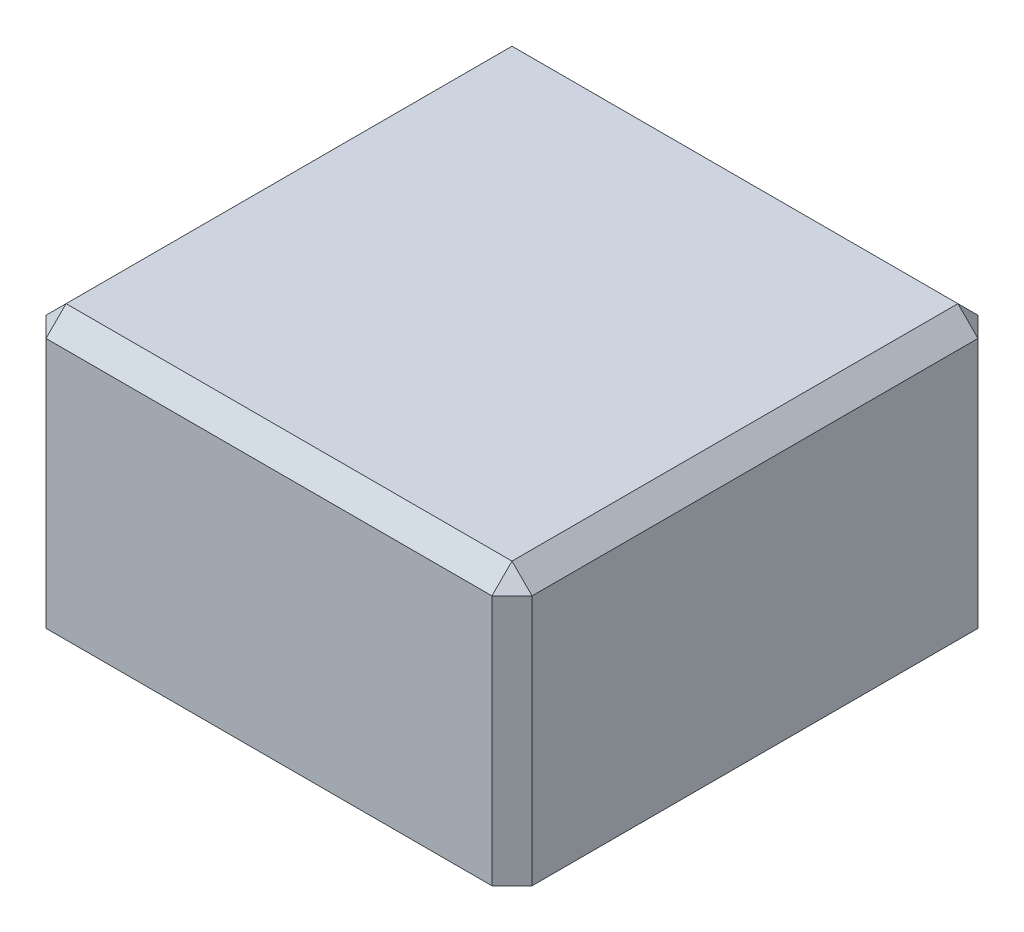
ISO-10303-21;
HEADER;
FILE_DESCRIPTION(('STEP AP214'),'2;1');
FILE_NAME('part.step','',(''),(''),'','','');
FILE_SCHEMA(('AUTOMOTIVE_DESIGN { 1 0 10303 214 1 1 1 1 }'));
ENDSEC;
DATA;
#1=APPLICATION_CONTEXT('core data for automotive mechanical design processes');
#2=APPLICATION_PROTOCOL_DEFINITION('international standard','automotive_design',2000,#1);
#3=PRODUCT_CONTEXT('',#1,'mechanical');
#4=PRODUCT('Part','Part','',(#3));
#5=PRODUCT_RELATED_PRODUCT_CATEGORY('part','',(#4));
#6=PRODUCT_DEFINITION_FORMATION('','',#4);
#7=PRODUCT_DEFINITION_CONTEXT('part definition',#1,'design');
#8=PRODUCT_DEFINITION('design','',#6,#7);
#9=PRODUCT_DEFINITION_SHAPE('','',#8);
#10=(LENGTH_UNIT() NAMED_UNIT(*) SI_UNIT(.MILLI.,.METRE.));
#11=(NAMED_UNIT(*) PLANE_ANGLE_UNIT() SI_UNIT($,.RADIAN.));
#12=(NAMED_UNIT(*) SI_UNIT($,.STERADIAN.) SOLID_ANGLE_UNIT());
#13=UNCERTAINTY_MEASURE_WITH_UNIT(LENGTH_MEASURE(1.E-05),#10,'distance_accuracy_value','');
#14=(GEOMETRIC_REPRESENTATION_CONTEXT(3) GLOBAL_UNCERTAINTY_ASSIGNED_CONTEXT((#13)) GLOBAL_UNIT_ASSIGNED_CONTEXT((#10,
#11,#12)) REPRESENTATION_CONTEXT('',''));
#15=CARTESIAN_POINT('',(0.,0.,0.));
#16=DIRECTION('',(0.,0.,1.));
#17=DIRECTION('',(1.,0.,0.));
#18=AXIS2_PLACEMENT_3D('',#15,#16,#17);
#19=CARTESIAN_POINT('',(-22.2,-63.4479364188578,24.2));
#20=DIRECTION('',(0.,0.,1.));
#21=DIRECTION('',(1.,0.,0.));
#22=AXIS2_PLACEMENT_3D('',#19,#20,#21);
#23=PLANE('',#22);
#24=DIRECTION('',(1.,0.,0.));
#25=VECTOR('',#24,1.);
#26=CARTESIAN_POINT('',(-22.2,5.2,24.2));
#27=LINE('',#26,#25);
#28=CARTESIAN_POINT('',(-22.2,5.2,24.2));
#29=VERTEX_POINT('',#28);
#30=CARTESIAN_POINT('',(22.2,5.2,24.2));
#31=VERTEX_POINT('',#30);
#32=EDGE_CURVE('E182',#29,#31,#27,.T.);
#33=ORIENTED_EDGE('',*,*,#32,.T.);
#34=DIRECTION('',(0.,1.,0.));
#35=VECTOR('',#34,1.);
#36=CARTESIAN_POINT('',(22.2,-63.4479364188578,24.2));
#37=LINE('',#36,#35);
#38=CARTESIAN_POINT('',(22.2,30.2,24.2));
#39=VERTEX_POINT('',#38);
#40=EDGE_CURVE('E225',#31,#39,#37,.T.);
#41=ORIENTED_EDGE('',*,*,#40,.T.);
#42=DIRECTION('',(-1.,0.,0.));
#43=VECTOR('',#42,1.);
#44=CARTESIAN_POINT('',(-22.2,30.2,24.2));
#45=LINE('',#44,#43);
#46=CARTESIAN_POINT('',(-22.2,30.2,24.2));
#47=VERTEX_POINT('',#46);
#48=EDGE_CURVE('E223',#39,#47,#45,.T.);
#49=ORIENTED_EDGE('',*,*,#48,.T.);
#50=DIRECTION('',(0.,-1.,0.));
#51=VECTOR('',#50,1.);
#52=CARTESIAN_POINT('',(-22.2,-63.4479364188578,24.2));
#53=LINE('',#52,#51);
#54=EDGE_CURVE('E221',#47,#29,#53,.T.);
#55=ORIENTED_EDGE('',*,*,#54,.T.);
#56=EDGE_LOOP('',(#33,#41,#49,#55));
#57=FACE_BOUND('',#56,.T.);
#58=ADVANCED_FACE('F38',(#57),#23,.T.);
#59=CARTESIAN_POINT('',(-24.2,-63.4479364188578,-22.2));
#60=DIRECTION('',(-1.,0.,0.));
#61=DIRECTION('',(0.,0.,1.));
#62=AXIS2_PLACEMENT_3D('',#59,#60,#61);
#63=PLANE('',#62);
#64=DIRECTION('',(0.,0.,1.));
#65=VECTOR('',#64,1.);
#66=CARTESIAN_POINT('',(-24.2,5.2,-22.2));
#67=LINE('',#66,#65);
#68=CARTESIAN_POINT('',(-24.2,5.2,-22.2));
#69=VERTEX_POINT('',#68);
#70=CARTESIAN_POINT('',(-24.2,5.2,22.2));
#71=VERTEX_POINT('',#70);
#72=EDGE_CURVE('E185',#69,#71,#67,.T.);
#73=ORIENTED_EDGE('',*,*,#72,.T.);
#74=DIRECTION('',(0.,1.,0.));
#75=VECTOR('',#74,1.);
#76=CARTESIAN_POINT('',(-24.2,-63.4479364188578,22.2));
#77=LINE('',#76,#75);
#78=CARTESIAN_POINT('',(-24.2,30.2,22.2));
#79=VERTEX_POINT('',#78);
#80=EDGE_CURVE('E11',#71,#79,#77,.T.);
#81=ORIENTED_EDGE('',*,*,#80,.T.);
#82=DIRECTION('',(0.,0.,-1.));
#83=VECTOR('',#82,1.);
#84=CARTESIAN_POINT('',(-24.2,30.2,-22.2));
#85=LINE('',#84,#83);
#86=CARTESIAN_POINT('',(-24.2,30.2,-22.2));
#87=VERTEX_POINT('',#86);
#88=EDGE_CURVE('E48',#79,#87,#85,.T.);
#89=ORIENTED_EDGE('',*,*,#88,.T.);
#90=DIRECTION('',(0.,-1.,0.));
#91=VECTOR('',#90,1.);
#92=CARTESIAN_POINT('',(-24.2,-63.4479364188578,-22.2));
#93=LINE('',#92,#91);
#94=EDGE_CURVE('E227',#87,#69,#93,.T.);
#95=ORIENTED_EDGE('',*,*,#94,.T.);
#96=EDGE_LOOP('',(#73,#81,#89,#95));
#97=FACE_BOUND('',#96,.T.);
#98=ADVANCED_FACE('F297',(#97),#63,.T.);
#99=CARTESIAN_POINT('',(22.2,-63.4479364188578,-24.2));
#100=DIRECTION('',(0.,0.,-1.));
#101=DIRECTION('',(-1.,0.,0.));
#102=AXIS2_PLACEMENT_3D('',#99,#100,#101);
#103=PLANE('',#102);
#104=DIRECTION('',(1.,0.,0.));
#105=VECTOR('',#104,1.);
#106=CARTESIAN_POINT('',(22.2,30.2,-24.2));
#107=LINE('',#106,#105);
#108=CARTESIAN_POINT('',(-22.2,30.2,-24.2));
#109=VERTEX_POINT('',#108);
#110=CARTESIAN_POINT('',(22.2,30.2,-24.2));
#111=VERTEX_POINT('',#110);
#112=EDGE_CURVE('E202',#109,#111,#107,.T.);
#113=ORIENTED_EDGE('',*,*,#112,.T.);
#114=DIRECTION('',(0.,-1.,0.));
#115=VECTOR('',#114,1.);
#116=CARTESIAN_POINT('',(22.2,-63.4479364188578,-24.2));
#117=LINE('',#116,#115);
#118=CARTESIAN_POINT('',(22.2,5.2,-24.2));
#119=VERTEX_POINT('',#118);
#120=EDGE_CURVE('E205',#111,#119,#117,.T.);
#121=ORIENTED_EDGE('',*,*,#120,.T.);
#122=DIRECTION('',(-1.,0.,0.));
#123=VECTOR('',#122,1.);
#124=CARTESIAN_POINT('',(22.2,5.2,-24.2));
#125=LINE('',#124,#123);
#126=CARTESIAN_POINT('',(-22.2,5.2,-24.2));
#127=VERTEX_POINT('',#126);
#128=EDGE_CURVE('E173',#119,#127,#125,.T.);
#129=ORIENTED_EDGE('',*,*,#128,.T.);
#130=DIRECTION('',(0.,1.,0.));
#131=VECTOR('',#130,1.);
#132=CARTESIAN_POINT('',(-22.2,-63.4479364188578,-24.2));
#133=LINE('',#132,#131);
#134=EDGE_CURVE('E200',#127,#109,#133,.T.);
#135=ORIENTED_EDGE('',*,*,#134,.T.);
#136=EDGE_LOOP('',(#113,#121,#129,#135));
#137=FACE_BOUND('',#136,.T.);
#138=ADVANCED_FACE('F312',(#137),#103,.T.);
#139=CARTESIAN_POINT('',(24.2,-63.4479364188578,22.2));
#140=DIRECTION('',(1.,0.,0.));
#141=DIRECTION('',(0.,0.,-1.));
#142=AXIS2_PLACEMENT_3D('',#139,#140,#141);
#143=PLANE('',#142);
#144=DIRECTION('',(0.,0.,-1.));
#145=VECTOR('',#144,1.);
#146=CARTESIAN_POINT('',(24.2,5.2,22.2));
#147=LINE('',#146,#145);
#148=CARTESIAN_POINT('',(24.2,5.2,22.2));
#149=VERTEX_POINT('',#148);
#150=CARTESIAN_POINT('',(24.2,5.2,-22.2));
#151=VERTEX_POINT('',#150);
#152=EDGE_CURVE('E167',#149,#151,#147,.T.);
#153=ORIENTED_EDGE('',*,*,#152,.T.);
#154=DIRECTION('',(0.,1.,0.));
#155=VECTOR('',#154,1.);
#156=CARTESIAN_POINT('',(24.2,-63.4479364188578,-22.2));
#157=LINE('',#156,#155);
#158=CARTESIAN_POINT('',(24.2,30.2,-22.2));
#159=VERTEX_POINT('',#158);
#160=EDGE_CURVE('E211',#151,#159,#157,.T.);
#161=ORIENTED_EDGE('',*,*,#160,.T.);
#162=DIRECTION('',(0.,0.,1.));
#163=VECTOR('',#162,1.);
#164=CARTESIAN_POINT('',(24.2,30.2,22.2));
#165=LINE('',#164,#163);
#166=CARTESIAN_POINT('',(24.2,30.2,22.2));
#167=VERTEX_POINT('',#166);
#168=EDGE_CURVE('E209',#159,#167,#165,.T.);
#169=ORIENTED_EDGE('',*,*,#168,.T.);
#170=DIRECTION('',(0.,-1.,0.));
#171=VECTOR('',#170,1.);
#172=CARTESIAN_POINT('',(24.2,-63.4479364188578,22.2));
#173=LINE('',#172,#171);
#174=EDGE_CURVE('E207',#167,#149,#173,.T.);
#175=ORIENTED_EDGE('',*,*,#174,.T.);
#176=EDGE_LOOP('',(#153,#161,#169,#175));
#177=FACE_BOUND('',#176,.T.);
#178=ADVANCED_FACE('F320',(#177),#143,.T.);
#179=CARTESIAN_POINT('',(-22.2,-63.4479364188578,22.2));
#180=DIRECTION('',(0.,0.,1.));
#181=DIRECTION('',(1.,0.,0.));
#182=AXIS2_PLACEMENT_3D('',#179,#180,#181);
#183=PLANE('',#182);
#184=DIRECTION('',(1.,0.,0.));
#185=VECTOR('',#184,1.);
#186=CARTESIAN_POINT('',(-22.2,5.2,22.2));
#187=LINE('',#186,#185);
#188=CARTESIAN_POINT('',(-22.2,5.2,22.2));
#189=VERTEX_POINT('',#188);
#190=CARTESIAN_POINT('',(22.2,5.2,22.2));
#191=VERTEX_POINT('',#190);
#192=EDGE_CURVE('E174',#189,#191,#187,.T.);
#193=ORIENTED_EDGE('',*,*,#192,.F.);
#194=DIRECTION('',(0.,1.,0.));
#195=VECTOR('',#194,1.);
#196=CARTESIAN_POINT('',(-22.2,-63.4479364188578,22.2));
#197=LINE('',#196,#195);
#198=CARTESIAN_POINT('',(-22.2,30.2,22.2));
#199=VERTEX_POINT('',#198);
#200=EDGE_CURVE('E160',#189,#199,#197,.T.);
#201=ORIENTED_EDGE('',*,*,#200,.T.);
#202=DIRECTION('',(1.,0.,0.));
#203=VECTOR('',#202,1.);
#204=CARTESIAN_POINT('',(-22.2,30.2,22.2));
#205=LINE('',#204,#203);
#206=CARTESIAN_POINT('',(22.2,30.2,22.2));
#207=VERTEX_POINT('',#206);
#208=EDGE_CURVE('E142',#199,#207,#205,.T.);
#209=ORIENTED_EDGE('',*,*,#208,.T.);
#210=DIRECTION('',(0.,1.,0.));
#211=VECTOR('',#210,1.);
#212=CARTESIAN_POINT('',(22.2,-63.4479364188578,22.2));
#213=LINE('',#212,#211);
#214=EDGE_CURVE('E149',#191,#207,#213,.T.);
#215=ORIENTED_EDGE('',*,*,#214,.F.);
#216=EDGE_LOOP('',(#193,#201,#209,#215));
#217=FACE_BOUND('',#216,.T.);
#218=ADVANCED_FACE('F158',(#217),#183,.F.);
#219=CARTESIAN_POINT('',(-22.2,-63.4479364188578,-22.2));
#220=DIRECTION('',(-1.,0.,0.));
#221=DIRECTION('',(0.,0.,1.));
#222=AXIS2_PLACEMENT_3D('',#219,#220,#221);
#223=PLANE('',#222);
#224=DIRECTION('',(0.,0.,1.));
#225=VECTOR('',#224,1.);
#226=CARTESIAN_POINT('',(-22.2,5.2,-22.2));
#227=LINE('',#226,#225);
#228=CARTESIAN_POINT('',(-22.2,5.2,-22.2));
#229=VERTEX_POINT('',#228);
#230=EDGE_CURVE('E148',#229,#189,#227,.T.);
#231=ORIENTED_EDGE('',*,*,#230,.F.);
#232=DIRECTION('',(0.,1.,0.));
#233=VECTOR('',#232,1.);
#234=CARTESIAN_POINT('',(-22.2,-63.4479364188578,-22.2));
#235=LINE('',#234,#233);
#236=CARTESIAN_POINT('',(-22.2,30.2,-22.2));
#237=VERTEX_POINT('',#236);
#238=EDGE_CURVE('E162',#229,#237,#235,.T.);
#239=ORIENTED_EDGE('',*,*,#238,.T.);
#240=DIRECTION('',(0.,0.,1.));
#241=VECTOR('',#240,1.);
#242=CARTESIAN_POINT('',(-22.2,30.2,-22.2));
#243=LINE('',#242,#241);
#244=EDGE_CURVE('E165',#237,#199,#243,.T.);
#245=ORIENTED_EDGE('',*,*,#244,.T.);
#246=ORIENTED_EDGE('',*,*,#200,.F.);
#247=EDGE_LOOP('',(#231,#239,#245,#246));
#248=FACE_BOUND('',#247,.T.);
#249=ADVANCED_FACE('F341',(#248),#223,.F.);
#250=CARTESIAN_POINT('',(22.2,-63.4479364188578,-22.2));
#251=DIRECTION('',(0.,0.,-1.));
#252=DIRECTION('',(-1.,0.,0.));
#253=AXIS2_PLACEMENT_3D('',#250,#251,#252);
#254=PLANE('',#253);
#255=DIRECTION('',(-1.,0.,0.));
#256=VECTOR('',#255,1.);
#257=CARTESIAN_POINT('',(22.2,5.2,-22.2));
#258=LINE('',#257,#256);
#259=CARTESIAN_POINT('',(22.2,5.2,-22.2));
#260=VERTEX_POINT('',#259);
#261=EDGE_CURVE('E178',#260,#229,#258,.T.);
#262=ORIENTED_EDGE('',*,*,#261,.F.);
#263=DIRECTION('',(0.,1.,0.));
#264=VECTOR('',#263,1.);
#265=CARTESIAN_POINT('',(22.2,-63.4479364188578,-22.2));
#266=LINE('',#265,#264);
#267=CARTESIAN_POINT('',(22.2,30.2,-22.2));
#268=VERTEX_POINT('',#267);
#269=EDGE_CURVE('E190',#260,#268,#266,.T.);
#270=ORIENTED_EDGE('',*,*,#269,.T.);
#271=DIRECTION('',(-1.,0.,0.));
#272=VECTOR('',#271,1.);
#273=CARTESIAN_POINT('',(22.2,30.2,-22.2));
#274=LINE('',#273,#272);
#275=EDGE_CURVE('E145',#268,#237,#274,.T.);
#276=ORIENTED_EDGE('',*,*,#275,.T.);
#277=ORIENTED_EDGE('',*,*,#238,.F.);
#278=EDGE_LOOP('',(#262,#270,#276,#277));
#279=FACE_BOUND('',#278,.T.);
#280=ADVANCED_FACE('F338',(#279),#254,.F.);
#281=CARTESIAN_POINT('',(22.2,-63.4479364188578,22.2));
#282=DIRECTION('',(1.,0.,0.));
#283=DIRECTION('',(0.,0.,-1.));
#284=AXIS2_PLACEMENT_3D('',#281,#282,#283);
#285=PLANE('',#284);
#286=DIRECTION('',(0.,0.,-1.));
#287=VECTOR('',#286,1.);
#288=CARTESIAN_POINT('',(22.2,5.2,22.2));
#289=LINE('',#288,#287);
#290=EDGE_CURVE('E154',#191,#260,#289,.T.);
#291=ORIENTED_EDGE('',*,*,#290,.F.);
#292=ORIENTED_EDGE('',*,*,#214,.T.);
#293=DIRECTION('',(0.,0.,-1.));
#294=VECTOR('',#293,1.);
#295=CARTESIAN_POINT('',(22.2,30.2,22.2));
#296=LINE('',#295,#294);
#297=EDGE_CURVE('E138',#207,#268,#296,.T.);
#298=ORIENTED_EDGE('',*,*,#297,.T.);
#299=ORIENTED_EDGE('',*,*,#269,.F.);
#300=EDGE_LOOP('',(#291,#292,#298,#299));
#301=FACE_BOUND('',#300,.T.);
#302=ADVANCED_FACE('F152',(#301),#285,.F.);
#303=CARTESIAN_POINT('',(0.,5.2,0.));
#304=DIRECTION('',(0.,-1.,0.));
#305=DIRECTION('',(0.,0.,-1.));
#306=AXIS2_PLACEMENT_3D('',#303,#304,#305);
#307=PLANE('',#306);
#308=ORIENTED_EDGE('',*,*,#128,.F.);
#309=DIRECTION('',(-0.707106781186544,0.,-0.707106781186551));
#310=VECTOR('',#309,1.);
#311=CARTESIAN_POINT('',(23.2000000000001,5.2,-23.1999999999999));
#312=LINE('',#311,#310);
#313=EDGE_CURVE('E219',#119,#151,#312,.F.);
#314=ORIENTED_EDGE('',*,*,#313,.T.);
#315=ORIENTED_EDGE('',*,*,#152,.F.);
#316=DIRECTION('',(0.707106781186549,0.,-0.707106781186546));
#317=VECTOR('',#316,1.);
#318=CARTESIAN_POINT('',(23.2,5.2,23.2));
#319=LINE('',#318,#317);
#320=EDGE_CURVE('E217',#149,#31,#319,.F.);
#321=ORIENTED_EDGE('',*,*,#320,.T.);
#322=ORIENTED_EDGE('',*,*,#32,.F.);
#323=DIRECTION('',(0.707106781186544,0.,0.707106781186551));
#324=VECTOR('',#323,1.);
#325=CARTESIAN_POINT('',(-23.2000000000001,5.2,23.1999999999999));
#326=LINE('',#325,#324);
#327=EDGE_CURVE('E215',#29,#71,#326,.F.);
#328=ORIENTED_EDGE('',*,*,#327,.T.);
#329=ORIENTED_EDGE('',*,*,#72,.F.);
#330=DIRECTION('',(-0.707106781186549,0.,0.707106781186546));
#331=VECTOR('',#330,1.);
#332=CARTESIAN_POINT('',(-23.2,5.2,-23.2));
#333=LINE('',#332,#331);
#334=EDGE_CURVE('E213',#69,#127,#333,.F.);
#335=ORIENTED_EDGE('',*,*,#334,.T.);
#336=EDGE_LOOP('',(#308,#314,#315,#321,#322,#328,#329,#335));
#337=FACE_BOUND('',#336,.T.);
#338=ORIENTED_EDGE('',*,*,#230,.T.);
#339=ORIENTED_EDGE('',*,*,#192,.T.);
#340=ORIENTED_EDGE('',*,*,#290,.T.);
#341=ORIENTED_EDGE('',*,*,#261,.T.);
#342=EDGE_LOOP('',(#338,#339,#340,#341));
#343=FACE_BOUND('',#342,.T.);
#344=ADVANCED_FACE('F294',(#337,#343),#307,.T.);
#345=CARTESIAN_POINT('',(0.,30.2,0.));
#346=DIRECTION('',(0.,1.,0.));
#347=DIRECTION('',(0.,0.,1.));
#348=AXIS2_PLACEMENT_3D('',#345,#346,#347);
#349=PLANE('',#348);
#350=ORIENTED_EDGE('',*,*,#208,.F.);
#351=ORIENTED_EDGE('',*,*,#244,.F.);
#352=ORIENTED_EDGE('',*,*,#275,.F.);
#353=ORIENTED_EDGE('',*,*,#297,.F.);
#354=EDGE_LOOP('',(#350,#351,#352,#353));
#355=FACE_BOUND('',#354,.T.);
#356=ADVANCED_FACE('F140',(#355),#349,.F.);
#357=CARTESIAN_POINT('',(0.,32.2,0.));
#358=DIRECTION('',(0.,1.,0.));
#359=DIRECTION('',(0.,0.,1.));
#360=AXIS2_PLACEMENT_3D('',#357,#358,#359);
#361=PLANE('',#360);
#362=DIRECTION('',(0.,0.,-1.));
#363=VECTOR('',#362,1.);
#364=CARTESIAN_POINT('',(22.2,32.2,0.));
#365=LINE('',#364,#363);
#366=CARTESIAN_POINT('',(22.2,32.2,22.2));
#367=VERTEX_POINT('',#366);
#368=CARTESIAN_POINT('',(22.2,32.2,-22.2));
#369=VERTEX_POINT('',#368);
#370=EDGE_CURVE('E195',#367,#369,#365,.T.);
#371=ORIENTED_EDGE('',*,*,#370,.T.);
#372=DIRECTION('',(-1.,0.,0.));
#373=VECTOR('',#372,1.);
#374=CARTESIAN_POINT('',(0.,32.2,-22.2));
#375=LINE('',#374,#373);
#376=CARTESIAN_POINT('',(-22.2,32.2,-22.2));
#377=VERTEX_POINT('',#376);
#378=EDGE_CURVE('E197',#369,#377,#375,.T.);
#379=ORIENTED_EDGE('',*,*,#378,.T.);
#380=DIRECTION('',(0.,0.,1.));
#381=VECTOR('',#380,1.);
#382=CARTESIAN_POINT('',(-22.2,32.2,0.));
#383=LINE('',#382,#381);
#384=CARTESIAN_POINT('',(-22.2,32.2,22.2));
#385=VERTEX_POINT('',#384);
#386=EDGE_CURVE('E181',#377,#385,#383,.T.);
#387=ORIENTED_EDGE('',*,*,#386,.T.);
#388=DIRECTION('',(1.,0.,0.));
#389=VECTOR('',#388,1.);
#390=CARTESIAN_POINT('',(0.,32.2,22.2));
#391=LINE('',#390,#389);
#392=EDGE_CURVE('E193',#385,#367,#391,.T.);
#393=ORIENTED_EDGE('',*,*,#392,.T.);
#394=EDGE_LOOP('',(#371,#379,#387,#393));
#395=FACE_BOUND('',#394,.T.);
#396=ADVANCED_FACE('F276',(#395),#361,.T.);
#397=CARTESIAN_POINT('',(22.2,-63.4479364188578,24.2));
#398=DIRECTION('',(-0.707106781186546,0.,-0.707106781186549));
#399=DIRECTION('',(0.,1.,0.));
#400=AXIS2_PLACEMENT_3D('',#397,#398,#399);
#401=PLANE('',#400);
#402=ORIENTED_EDGE('',*,*,#320,.F.);
#403=ORIENTED_EDGE('',*,*,#174,.F.);
#404=DIRECTION('',(-0.707106781186549,0.,0.707106781186546));
#405=VECTOR('',#404,1.);
#406=CARTESIAN_POINT('',(24.2,30.2,22.2));
#407=LINE('',#406,#405);
#408=EDGE_CURVE('E43',#39,#167,#407,.F.);
#409=ORIENTED_EDGE('',*,*,#408,.F.);
#410=ORIENTED_EDGE('',*,*,#40,.F.);
#411=EDGE_LOOP('',(#402,#403,#409,#410));
#412=FACE_BOUND('',#411,.T.);
#413=ADVANCED_FACE('F41',(#412),#401,.F.);
#414=CARTESIAN_POINT('',(0.,32.2,22.2));
#415=DIRECTION('',(0.,-0.707106781186545,-0.70710678118655));
#416=DIRECTION('',(1.,0.,0.));
#417=AXIS2_PLACEMENT_3D('',#414,#415,#416);
#418=PLANE('',#417);
#419=DIRECTION('',(0.,-0.70710678118655,0.707106781186545));
#420=VECTOR('',#419,1.);
#421=CARTESIAN_POINT('',(-22.2,30.2,24.2));
#422=LINE('',#421,#420);
#423=EDGE_CURVE('E255',#47,#385,#422,.F.);
#424=ORIENTED_EDGE('',*,*,#423,.F.);
#425=ORIENTED_EDGE('',*,*,#48,.F.);
#426=DIRECTION('',(0.,0.70710678118655,-0.707106781186545));
#427=VECTOR('',#426,1.);
#428=CARTESIAN_POINT('',(22.2,31.2,23.2));
#429=LINE('',#428,#427);
#430=EDGE_CURVE('E257',#367,#39,#429,.F.);
#431=ORIENTED_EDGE('',*,*,#430,.F.);
#432=ORIENTED_EDGE('',*,*,#392,.F.);
#433=EDGE_LOOP('',(#424,#425,#431,#432));
#434=FACE_BOUND('',#433,.T.);
#435=ADVANCED_FACE('F283',(#434),#418,.F.);
#436=CARTESIAN_POINT('',(-24.2,-63.4479364188578,22.2));
#437=DIRECTION('',(0.707106781186551,0.,-0.707106781186544));
#438=DIRECTION('',(0.,1.,0.));
#439=AXIS2_PLACEMENT_3D('',#436,#437,#438);
#440=PLANE('',#439);
#441=ORIENTED_EDGE('',*,*,#327,.F.);
#442=ORIENTED_EDGE('',*,*,#54,.F.);
#443=DIRECTION('',(-0.707106781186544,0.,-0.707106781186551));
#444=VECTOR('',#443,1.);
#445=CARTESIAN_POINT('',(-22.2,30.2,24.2));
#446=LINE('',#445,#444);
#447=EDGE_CURVE('E252',#79,#47,#446,.F.);
#448=ORIENTED_EDGE('',*,*,#447,.F.);
#449=ORIENTED_EDGE('',*,*,#80,.F.);
#450=EDGE_LOOP('',(#441,#442,#448,#449));
#451=FACE_BOUND('',#450,.T.);
#452=ADVANCED_FACE('F289',(#451),#440,.F.);
#453=CARTESIAN_POINT('',(24.2,30.2,22.2));
#454=DIRECTION('',(0.577350269189626,0.577350269189624,0.577350269189628));
#455=DIRECTION('',(0.707106781186549,0.,-0.707106781186546));
#456=AXIS2_PLACEMENT_3D('',#453,#454,#455);
#457=PLANE('',#456);
#458=ORIENTED_EDGE('',*,*,#430,.T.);
#459=ORIENTED_EDGE('',*,*,#408,.T.);
#460=DIRECTION('',(0.707106781186545,-0.70710678118655,0.));
#461=VECTOR('',#460,1.);
#462=CARTESIAN_POINT('',(24.2,30.2,22.2));
#463=LINE('',#462,#461);
#464=EDGE_CURVE('E249',#367,#167,#463,.T.);
#465=ORIENTED_EDGE('',*,*,#464,.F.);
#466=EDGE_LOOP('',(#458,#459,#465));
#467=FACE_BOUND('',#466,.T.);
#468=ADVANCED_FACE('F264',(#467),#457,.T.);
#469=CARTESIAN_POINT('',(-22.2,30.2,24.2));
#470=DIRECTION('',(-0.577350269189631,0.577350269189622,0.577350269189625));
#471=DIRECTION('',(0.707106781186544,0.,0.707106781186551));
#472=AXIS2_PLACEMENT_3D('',#469,#470,#471);
#473=PLANE('',#472);
#474=ORIENTED_EDGE('',*,*,#447,.T.);
#475=ORIENTED_EDGE('',*,*,#423,.T.);
#476=DIRECTION('',(0.707106781186545,0.70710678118655,0.));
#477=VECTOR('',#476,1.);
#478=CARTESIAN_POINT('',(-23.2,31.2,22.2));
#479=LINE('',#478,#477);
#480=EDGE_CURVE('E246',#79,#385,#479,.T.);
#481=ORIENTED_EDGE('',*,*,#480,.F.);
#482=EDGE_LOOP('',(#474,#475,#481));
#483=FACE_BOUND('',#482,.T.);
#484=ADVANCED_FACE('F388',(#483),#473,.T.);
#485=CARTESIAN_POINT('',(24.2,-63.4479364188578,-22.2));
#486=DIRECTION('',(-0.707106781186551,0.,0.707106781186544));
#487=DIRECTION('',(0.,1.,0.));
#488=AXIS2_PLACEMENT_3D('',#485,#486,#487);
#489=PLANE('',#488);
#490=ORIENTED_EDGE('',*,*,#313,.F.);
#491=ORIENTED_EDGE('',*,*,#120,.F.);
#492=DIRECTION('',(0.707106781186544,0.,0.707106781186551));
#493=VECTOR('',#492,1.);
#494=CARTESIAN_POINT('',(22.2,30.2,-24.2));
#495=LINE('',#494,#493);
#496=EDGE_CURVE('E243',#159,#111,#495,.F.);
#497=ORIENTED_EDGE('',*,*,#496,.F.);
#498=ORIENTED_EDGE('',*,*,#160,.F.);
#499=EDGE_LOOP('',(#490,#491,#497,#498));
#500=FACE_BOUND('',#499,.T.);
#501=ADVANCED_FACE('F318',(#500),#489,.F.);
#502=CARTESIAN_POINT('',(22.2,32.2,0.));
#503=DIRECTION('',(-0.70710678118655,-0.707106781186545,0.));
#504=DIRECTION('',(0.,0.,-1.));
#505=AXIS2_PLACEMENT_3D('',#502,#503,#504);
#506=PLANE('',#505);
#507=ORIENTED_EDGE('',*,*,#464,.T.);
#508=ORIENTED_EDGE('',*,*,#168,.F.);
#509=DIRECTION('',(-0.707106781186545,0.70710678118655,0.));
#510=VECTOR('',#509,1.);
#511=CARTESIAN_POINT('',(23.2,31.2,-22.2));
#512=LINE('',#511,#510);
#513=EDGE_CURVE('E240',#369,#159,#512,.F.);
#514=ORIENTED_EDGE('',*,*,#513,.F.);
#515=ORIENTED_EDGE('',*,*,#370,.F.);
#516=EDGE_LOOP('',(#507,#508,#514,#515));
#517=FACE_BOUND('',#516,.T.);
#518=ADVANCED_FACE('F271',(#517),#506,.F.);
#519=CARTESIAN_POINT('',(-22.2,32.2,0.));
#520=DIRECTION('',(0.70710678118655,-0.707106781186545,0.));
#521=DIRECTION('',(0.,0.,1.));
#522=AXIS2_PLACEMENT_3D('',#519,#520,#521);
#523=PLANE('',#522);
#524=ORIENTED_EDGE('',*,*,#480,.T.);
#525=ORIENTED_EDGE('',*,*,#386,.F.);
#526=DIRECTION('',(-0.707106781186545,-0.70710678118655,0.));
#527=VECTOR('',#526,1.);
#528=CARTESIAN_POINT('',(-22.2,32.2,-22.2));
#529=LINE('',#528,#527);
#530=EDGE_CURVE('E237',#87,#377,#529,.F.);
#531=ORIENTED_EDGE('',*,*,#530,.F.);
#532=ORIENTED_EDGE('',*,*,#88,.F.);
#533=EDGE_LOOP('',(#524,#525,#531,#532));
#534=FACE_BOUND('',#533,.T.);
#535=ADVANCED_FACE('F305',(#534),#523,.F.);
#536=CARTESIAN_POINT('',(-22.2,-63.4479364188578,-24.2));
#537=DIRECTION('',(0.707106781186546,0.,0.707106781186549));
#538=DIRECTION('',(0.,1.,0.));
#539=AXIS2_PLACEMENT_3D('',#536,#537,#538);
#540=PLANE('',#539);
#541=ORIENTED_EDGE('',*,*,#334,.F.);
#542=ORIENTED_EDGE('',*,*,#94,.F.);
#543=DIRECTION('',(0.707106781186549,0.,-0.707106781186546));
#544=VECTOR('',#543,1.);
#545=CARTESIAN_POINT('',(-23.2,30.2,-23.2));
#546=LINE('',#545,#544);
#547=EDGE_CURVE('E234',#109,#87,#546,.F.);
#548=ORIENTED_EDGE('',*,*,#547,.F.);
#549=ORIENTED_EDGE('',*,*,#134,.F.);
#550=EDGE_LOOP('',(#541,#542,#548,#549));
#551=FACE_BOUND('',#550,.T.);
#552=ADVANCED_FACE('F301',(#551),#540,.F.);
#553=CARTESIAN_POINT('',(22.2,30.2,-24.2));
#554=DIRECTION('',(0.577350269189631,0.577350269189626,-0.57735026918962));
#555=DIRECTION('',(-0.707106781186545,0.70710678118655,0.));
#556=AXIS2_PLACEMENT_3D('',#553,#554,#555);
#557=PLANE('',#556);
#558=ORIENTED_EDGE('',*,*,#513,.T.);
#559=ORIENTED_EDGE('',*,*,#496,.T.);
#560=DIRECTION('',(0.,-0.707106781186545,-0.70710678118655));
#561=VECTOR('',#560,1.);
#562=CARTESIAN_POINT('',(22.2,30.2,-24.2));
#563=LINE('',#562,#561);
#564=EDGE_CURVE('E232',#369,#111,#563,.T.);
#565=ORIENTED_EDGE('',*,*,#564,.F.);
#566=EDGE_LOOP('',(#558,#559,#565));
#567=FACE_BOUND('',#566,.T.);
#568=ADVANCED_FACE('F361',(#567),#557,.T.);
#569=CARTESIAN_POINT('',(-22.2,32.2,-22.2));
#570=DIRECTION('',(-0.577350269189626,0.577350269189628,-0.577350269189624));
#571=DIRECTION('',(-0.707106781186549,-0.707106781186546,0.));
#572=AXIS2_PLACEMENT_3D('',#569,#570,#571);
#573=PLANE('',#572);
#574=ORIENTED_EDGE('',*,*,#547,.T.);
#575=ORIENTED_EDGE('',*,*,#530,.T.);
#576=DIRECTION('',(0.,0.707106781186545,0.70710678118655));
#577=VECTOR('',#576,1.);
#578=CARTESIAN_POINT('',(-22.2,32.2,-22.2));
#579=LINE('',#578,#577);
#580=EDGE_CURVE('E230',#109,#377,#579,.T.);
#581=ORIENTED_EDGE('',*,*,#580,.F.);
#582=EDGE_LOOP('',(#574,#575,#581));
#583=FACE_BOUND('',#582,.T.);
#584=ADVANCED_FACE('F308',(#583),#573,.T.);
#585=CARTESIAN_POINT('',(0.,32.2,-22.2));
#586=DIRECTION('',(0.,-0.70710678118655,0.707106781186545));
#587=DIRECTION('',(-1.,0.,0.));
#588=AXIS2_PLACEMENT_3D('',#585,#586,#587);
#589=PLANE('',#588);
#590=ORIENTED_EDGE('',*,*,#564,.T.);
#591=ORIENTED_EDGE('',*,*,#112,.F.);
#592=ORIENTED_EDGE('',*,*,#580,.T.);
#593=ORIENTED_EDGE('',*,*,#378,.F.);
#594=EDGE_LOOP('',(#590,#591,#592,#593));
#595=FACE_BOUND('',#594,.T.);
#596=ADVANCED_FACE('F310',(#595),#589,.F.);
#597=CLOSED_SHELL('',(#58,#98,#138,#178,#218,#249,#280,#302,#344,#356,#396,#413,#435,#452,#468,
#484,#501,#518,#535,#552,#568,#584,#596));
#598=MANIFOLD_SOLID_BREP('B2',#597);
#599=ADVANCED_BREP_SHAPE_REPRESENTATION('',(#18,#598),#14);
#600=SHAPE_DEFINITION_REPRESENTATION(#9,#599);
ENDSEC;
END-ISO-10303-21;
